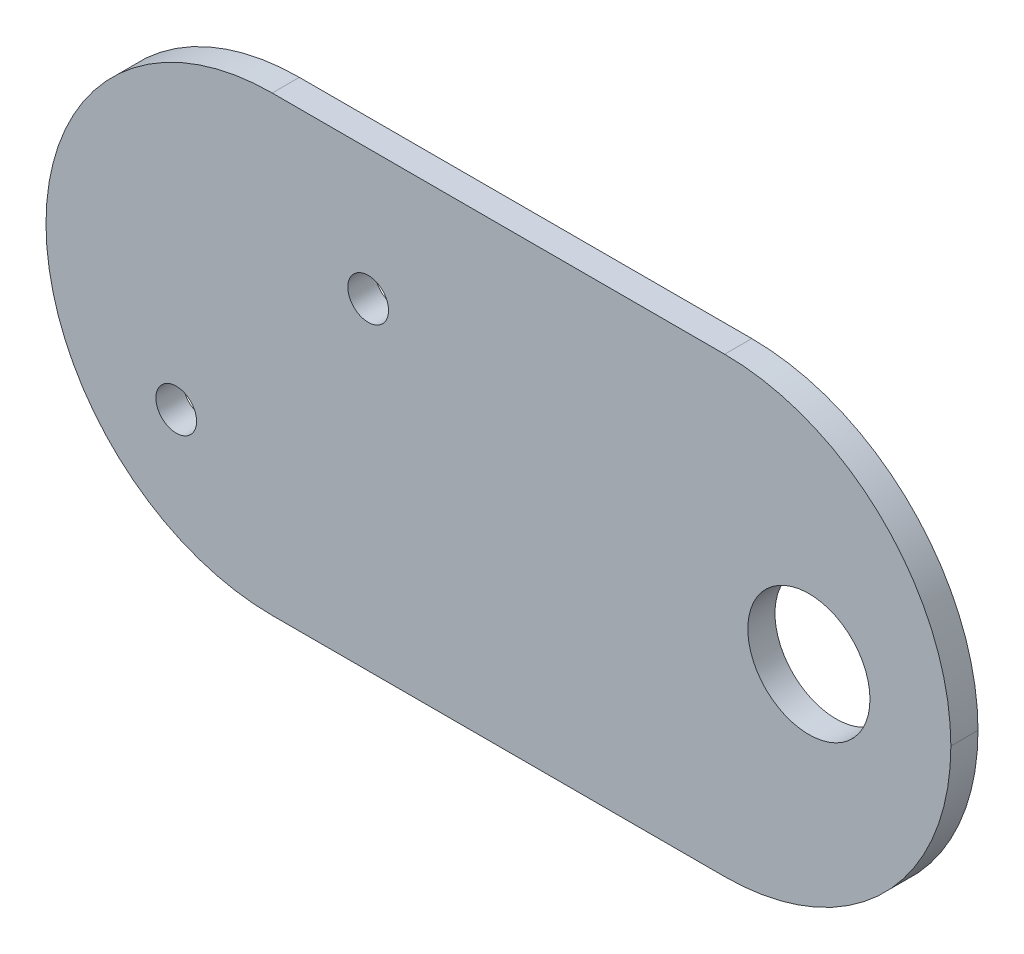
ISO-10303-21;
HEADER;
FILE_DESCRIPTION(('STEP AP214'),'2;1');
FILE_NAME('part.step','',(''),(''),'','','');
FILE_SCHEMA(('AUTOMOTIVE_DESIGN { 1 0 10303 214 1 1 1 1 }'));
ENDSEC;
DATA;
#1=APPLICATION_CONTEXT('core data for automotive mechanical design processes');
#2=APPLICATION_PROTOCOL_DEFINITION('international standard','automotive_design',2000,#1);
#3=PRODUCT_CONTEXT('',#1,'mechanical');
#4=PRODUCT('Part','Part','',(#3));
#5=PRODUCT_RELATED_PRODUCT_CATEGORY('part','',(#4));
#6=PRODUCT_DEFINITION_FORMATION('','',#4);
#7=PRODUCT_DEFINITION_CONTEXT('part definition',#1,'design');
#8=PRODUCT_DEFINITION('design','',#6,#7);
#9=PRODUCT_DEFINITION_SHAPE('','',#8);
#10=(LENGTH_UNIT() NAMED_UNIT(*) SI_UNIT(.MILLI.,.METRE.));
#11=(NAMED_UNIT(*) PLANE_ANGLE_UNIT() SI_UNIT($,.RADIAN.));
#12=(NAMED_UNIT(*) SI_UNIT($,.STERADIAN.) SOLID_ANGLE_UNIT());
#13=UNCERTAINTY_MEASURE_WITH_UNIT(LENGTH_MEASURE(1.E-05),#10,'distance_accuracy_value','');
#14=(GEOMETRIC_REPRESENTATION_CONTEXT(3) GLOBAL_UNCERTAINTY_ASSIGNED_CONTEXT((#13)) GLOBAL_UNIT_ASSIGNED_CONTEXT((#10,
#11,#12)) REPRESENTATION_CONTEXT('',''));
#15=CARTESIAN_POINT('',(0.,0.,0.));
#16=DIRECTION('',(0.,0.,1.));
#17=DIRECTION('',(1.,0.,0.));
#18=AXIS2_PLACEMENT_3D('',#15,#16,#17);
#19=CARTESIAN_POINT('',(-50.,25.,3.));
#20=DIRECTION('',(0.,-1.,0.));
#21=DIRECTION('',(0.,0.,-1.));
#22=AXIS2_PLACEMENT_3D('',#19,#20,#21);
#23=PLANE('',#22);
#24=DIRECTION('',(-1.,0.,0.));
#25=VECTOR('',#24,1.);
#26=CARTESIAN_POINT('',(-50.,25.,3.));
#27=LINE('',#26,#25);
#28=CARTESIAN_POINT('',(25.,25.,3.));
#29=VERTEX_POINT('',#28);
#30=CARTESIAN_POINT('',(-25.,25.,3.));
#31=VERTEX_POINT('',#30);
#32=EDGE_CURVE('E106',#29,#31,#27,.T.);
#33=ORIENTED_EDGE('',*,*,#32,.F.);
#34=DIRECTION('',(0.,0.,-1.));
#35=VECTOR('',#34,1.);
#36=CARTESIAN_POINT('',(25.,25.,3.));
#37=LINE('',#36,#35);
#38=CARTESIAN_POINT('',(25.,25.,0.));
#39=VERTEX_POINT('',#38);
#40=EDGE_CURVE('E91',#29,#39,#37,.T.);
#41=ORIENTED_EDGE('',*,*,#40,.T.);
#42=DIRECTION('',(-1.,0.,0.));
#43=VECTOR('',#42,1.);
#44=CARTESIAN_POINT('',(-50.,25.,0.));
#45=LINE('',#44,#43);
#46=CARTESIAN_POINT('',(-25.,25.,0.));
#47=VERTEX_POINT('',#46);
#48=EDGE_CURVE('E103',#39,#47,#45,.T.);
#49=ORIENTED_EDGE('',*,*,#48,.T.);
#50=DIRECTION('',(0.,0.,-1.));
#51=VECTOR('',#50,1.);
#52=CARTESIAN_POINT('',(-25.,25.,3.));
#53=LINE('',#52,#51);
#54=EDGE_CURVE('E108',#47,#31,#53,.F.);
#55=ORIENTED_EDGE('',*,*,#54,.T.);
#56=EDGE_LOOP('',(#33,#41,#49,#55));
#57=FACE_BOUND('',#56,.T.);
#58=ADVANCED_FACE('F33',(#57),#23,.F.);
#59=CARTESIAN_POINT('',(-50.,-25.,3.));
#60=DIRECTION('',(0.,1.,0.));
#61=DIRECTION('',(0.,0.,1.));
#62=AXIS2_PLACEMENT_3D('',#59,#60,#61);
#63=PLANE('',#62);
#64=DIRECTION('',(1.,0.,0.));
#65=VECTOR('',#64,1.);
#66=CARTESIAN_POINT('',(-50.,-25.,0.));
#67=LINE('',#66,#65);
#68=CARTESIAN_POINT('',(-25.,-25.,0.));
#69=VERTEX_POINT('',#68);
#70=CARTESIAN_POINT('',(25.,-25.,0.));
#71=VERTEX_POINT('',#70);
#72=EDGE_CURVE('E112',#69,#71,#67,.T.);
#73=ORIENTED_EDGE('',*,*,#72,.T.);
#74=DIRECTION('',(0.,0.,-1.));
#75=VECTOR('',#74,1.);
#76=CARTESIAN_POINT('',(25.,-25.,3.));
#77=LINE('',#76,#75);
#78=CARTESIAN_POINT('',(25.,-25.,3.));
#79=VERTEX_POINT('',#78);
#80=EDGE_CURVE('E11',#71,#79,#77,.F.);
#81=ORIENTED_EDGE('',*,*,#80,.T.);
#82=DIRECTION('',(1.,0.,0.));
#83=VECTOR('',#82,1.);
#84=CARTESIAN_POINT('',(-50.,-25.,3.));
#85=LINE('',#84,#83);
#86=CARTESIAN_POINT('',(-25.,-25.,3.));
#87=VERTEX_POINT('',#86);
#88=EDGE_CURVE('E120',#87,#79,#85,.T.);
#89=ORIENTED_EDGE('',*,*,#88,.F.);
#90=DIRECTION('',(0.,0.,-1.));
#91=VECTOR('',#90,1.);
#92=CARTESIAN_POINT('',(-25.,-25.,3.));
#93=LINE('',#92,#91);
#94=EDGE_CURVE('E42',#87,#69,#93,.T.);
#95=ORIENTED_EDGE('',*,*,#94,.T.);
#96=EDGE_LOOP('',(#73,#81,#89,#95));
#97=FACE_BOUND('',#96,.T.);
#98=ADVANCED_FACE('F171',(#97),#63,.F.);
#99=CARTESIAN_POINT('',(0.,0.,3.));
#100=DIRECTION('',(0.,0.,-1.));
#101=DIRECTION('',(-1.,0.,0.));
#102=AXIS2_PLACEMENT_3D('',#99,#100,#101);
#103=PLANE('',#102);
#104=CARTESIAN_POINT('',(-14.3933982822018,10.6066017177982,3.));
#105=DIRECTION('',(0.,0.,1.));
#106=DIRECTION('',(1.,0.,0.));
#107=AXIS2_PLACEMENT_3D('',#104,#105,#106);
#108=CIRCLE('',#107,2.25);
#109=CARTESIAN_POINT('',(-12.1433982822018,10.6066017177982,3.));
#110=VERTEX_POINT('',#109);
#111=EDGE_CURVE('E153',#110,#110,#108,.T.);
#112=ORIENTED_EDGE('',*,*,#111,.F.);
#113=EDGE_LOOP('',(#112));
#114=FACE_BOUND('',#113,.T.);
#115=CARTESIAN_POINT('',(-35.6066017177982,-10.6066017177982,3.));
#116=DIRECTION('',(0.,0.,1.));
#117=DIRECTION('',(1.,0.,0.));
#118=AXIS2_PLACEMENT_3D('',#115,#116,#117);
#119=CIRCLE('',#118,2.25);
#120=CARTESIAN_POINT('',(-33.3566017177982,-10.6066017177982,3.));
#121=VERTEX_POINT('',#120);
#122=EDGE_CURVE('E135',#121,#121,#119,.T.);
#123=ORIENTED_EDGE('',*,*,#122,.F.);
#124=EDGE_LOOP('',(#123));
#125=FACE_BOUND('',#124,.T.);
#126=CARTESIAN_POINT('',(34.3104530112441,0.,3.));
#127=DIRECTION('',(0.,0.,1.));
#128=DIRECTION('',(1.,0.,0.));
#129=AXIS2_PLACEMENT_3D('',#126,#127,#128);
#130=CIRCLE('',#129,6.75);
#131=CARTESIAN_POINT('',(41.0604530112441,0.,3.));
#132=VERTEX_POINT('',#131);
#133=EDGE_CURVE('E117',#132,#132,#130,.T.);
#134=ORIENTED_EDGE('',*,*,#133,.F.);
#135=EDGE_LOOP('',(#134));
#136=FACE_BOUND('',#135,.T.);
#137=CARTESIAN_POINT('',(25.,0.,3.));
#138=DIRECTION('',(0.,0.,-1.));
#139=DIRECTION('',(-1.,0.,0.));
#140=AXIS2_PLACEMENT_3D('',#137,#138,#139);
#141=CIRCLE('',#140,25.);
#142=CARTESIAN_POINT('',(50.,0.,3.));
#143=VERTEX_POINT('',#142);
#144=EDGE_CURVE('E130',#79,#143,#141,.F.);
#145=ORIENTED_EDGE('',*,*,#144,.T.);
#146=CARTESIAN_POINT('',(25.,0.,3.));
#147=DIRECTION('',(0.,0.,-1.));
#148=DIRECTION('',(-1.,0.,0.));
#149=AXIS2_PLACEMENT_3D('',#146,#147,#148);
#150=CIRCLE('',#149,25.);
#151=EDGE_CURVE('E132',#143,#29,#150,.F.);
#152=ORIENTED_EDGE('',*,*,#151,.T.);
#153=ORIENTED_EDGE('',*,*,#32,.T.);
#154=CARTESIAN_POINT('',(-25.,0.,3.));
#155=DIRECTION('',(0.,0.,-1.));
#156=DIRECTION('',(-1.,0.,0.));
#157=AXIS2_PLACEMENT_3D('',#154,#155,#156);
#158=CIRCLE('',#157,25.);
#159=CARTESIAN_POINT('',(-50.,0.,3.));
#160=VERTEX_POINT('',#159);
#161=EDGE_CURVE('E97',#31,#160,#158,.F.);
#162=ORIENTED_EDGE('',*,*,#161,.T.);
#163=CARTESIAN_POINT('',(-25.,0.,3.));
#164=DIRECTION('',(0.,0.,-1.));
#165=DIRECTION('',(-1.,0.,0.));
#166=AXIS2_PLACEMENT_3D('',#163,#164,#165);
#167=CIRCLE('',#166,25.);
#168=EDGE_CURVE('E55',#160,#87,#167,.F.);
#169=ORIENTED_EDGE('',*,*,#168,.T.);
#170=ORIENTED_EDGE('',*,*,#88,.T.);
#171=EDGE_LOOP('',(#145,#152,#153,#162,#169,#170));
#172=FACE_BOUND('',#171,.T.);
#173=ADVANCED_FACE('F146',(#114,#125,#136,#172),#103,.F.);
#174=CARTESIAN_POINT('',(0.,0.,0.));
#175=DIRECTION('',(0.,0.,-1.));
#176=DIRECTION('',(-1.,0.,0.));
#177=AXIS2_PLACEMENT_3D('',#174,#175,#176);
#178=PLANE('',#177);
#179=CARTESIAN_POINT('',(-14.3933982822018,10.6066017177982,0.));
#180=DIRECTION('',(0.,0.,1.));
#181=DIRECTION('',(1.,0.,0.));
#182=AXIS2_PLACEMENT_3D('',#179,#180,#181);
#183=CIRCLE('',#182,2.25);
#184=CARTESIAN_POINT('',(-12.1433982822018,10.6066017177982,0.));
#185=VERTEX_POINT('',#184);
#186=EDGE_CURVE('E149',#185,#185,#183,.T.);
#187=ORIENTED_EDGE('',*,*,#186,.T.);
#188=EDGE_LOOP('',(#187));
#189=FACE_BOUND('',#188,.T.);
#190=CARTESIAN_POINT('',(-35.6066017177982,-10.6066017177982,0.));
#191=DIRECTION('',(0.,0.,1.));
#192=DIRECTION('',(1.,0.,0.));
#193=AXIS2_PLACEMENT_3D('',#190,#191,#192);
#194=CIRCLE('',#193,2.25);
#195=CARTESIAN_POINT('',(-33.3566017177982,-10.6066017177982,0.));
#196=VERTEX_POINT('',#195);
#197=EDGE_CURVE('E137',#196,#196,#194,.T.);
#198=ORIENTED_EDGE('',*,*,#197,.T.);
#199=EDGE_LOOP('',(#198));
#200=FACE_BOUND('',#199,.T.);
#201=CARTESIAN_POINT('',(34.3104530112441,0.,0.));
#202=DIRECTION('',(0.,0.,1.));
#203=DIRECTION('',(1.,0.,0.));
#204=AXIS2_PLACEMENT_3D('',#201,#202,#203);
#205=CIRCLE('',#204,6.75);
#206=CARTESIAN_POINT('',(41.0604530112441,0.,0.));
#207=VERTEX_POINT('',#206);
#208=EDGE_CURVE('E113',#207,#207,#205,.T.);
#209=ORIENTED_EDGE('',*,*,#208,.T.);
#210=EDGE_LOOP('',(#209));
#211=FACE_BOUND('',#210,.T.);
#212=ORIENTED_EDGE('',*,*,#48,.F.);
#213=CARTESIAN_POINT('',(25.,0.,0.));
#214=DIRECTION('',(0.,0.,-1.));
#215=DIRECTION('',(-1.,0.,0.));
#216=AXIS2_PLACEMENT_3D('',#213,#214,#215);
#217=CIRCLE('',#216,25.);
#218=CARTESIAN_POINT('',(50.,0.,0.));
#219=VERTEX_POINT('',#218);
#220=EDGE_CURVE('E87',#39,#219,#217,.T.);
#221=ORIENTED_EDGE('',*,*,#220,.T.);
#222=CARTESIAN_POINT('',(25.,0.,0.));
#223=DIRECTION('',(0.,0.,-1.));
#224=DIRECTION('',(-1.,0.,0.));
#225=AXIS2_PLACEMENT_3D('',#222,#223,#224);
#226=CIRCLE('',#225,25.);
#227=EDGE_CURVE('E98',#219,#71,#226,.T.);
#228=ORIENTED_EDGE('',*,*,#227,.T.);
#229=ORIENTED_EDGE('',*,*,#72,.F.);
#230=CARTESIAN_POINT('',(-25.,0.,0.));
#231=DIRECTION('',(0.,0.,-1.));
#232=DIRECTION('',(-1.,0.,0.));
#233=AXIS2_PLACEMENT_3D('',#230,#231,#232);
#234=CIRCLE('',#233,25.);
#235=CARTESIAN_POINT('',(-50.,0.,0.));
#236=VERTEX_POINT('',#235);
#237=EDGE_CURVE('E125',#69,#236,#234,.T.);
#238=ORIENTED_EDGE('',*,*,#237,.T.);
#239=CARTESIAN_POINT('',(-25.,0.,0.));
#240=DIRECTION('',(0.,0.,-1.));
#241=DIRECTION('',(-1.,0.,0.));
#242=AXIS2_PLACEMENT_3D('',#239,#240,#241);
#243=CIRCLE('',#242,25.);
#244=EDGE_CURVE('E107',#236,#47,#243,.T.);
#245=ORIENTED_EDGE('',*,*,#244,.T.);
#246=EDGE_LOOP('',(#212,#221,#228,#229,#238,#245));
#247=FACE_BOUND('',#246,.T.);
#248=ADVANCED_FACE('F110',(#189,#200,#211,#247),#178,.T.);
#249=CARTESIAN_POINT('',(34.3104530112441,0.,0.));
#250=DIRECTION('',(0.,0.,1.));
#251=DIRECTION('',(1.,0.,0.));
#252=AXIS2_PLACEMENT_3D('',#249,#250,#251);
#253=CYLINDRICAL_SURFACE('',#252,6.75);
#254=ORIENTED_EDGE('',*,*,#208,.F.);
#255=EDGE_LOOP('',(#254));
#256=FACE_BOUND('',#255,.T.);
#257=ORIENTED_EDGE('',*,*,#133,.T.);
#258=EDGE_LOOP('',(#257));
#259=FACE_BOUND('',#258,.T.);
#260=ADVANCED_FACE('F177',(#256,#259),#253,.F.);
#261=CARTESIAN_POINT('',(-35.6066017177982,-10.6066017177982,0.));
#262=DIRECTION('',(0.,0.,1.));
#263=DIRECTION('',(1.,0.,0.));
#264=AXIS2_PLACEMENT_3D('',#261,#262,#263);
#265=CYLINDRICAL_SURFACE('',#264,2.25);
#266=ORIENTED_EDGE('',*,*,#197,.F.);
#267=EDGE_LOOP('',(#266));
#268=FACE_BOUND('',#267,.T.);
#269=ORIENTED_EDGE('',*,*,#122,.T.);
#270=EDGE_LOOP('',(#269));
#271=FACE_BOUND('',#270,.T.);
#272=ADVANCED_FACE('F165',(#268,#271),#265,.F.);
#273=CARTESIAN_POINT('',(-14.3933982822018,10.6066017177982,0.));
#274=DIRECTION('',(0.,0.,1.));
#275=DIRECTION('',(1.,0.,0.));
#276=AXIS2_PLACEMENT_3D('',#273,#274,#275);
#277=CYLINDRICAL_SURFACE('',#276,2.25);
#278=ORIENTED_EDGE('',*,*,#186,.F.);
#279=EDGE_LOOP('',(#278));
#280=FACE_BOUND('',#279,.T.);
#281=ORIENTED_EDGE('',*,*,#111,.T.);
#282=EDGE_LOOP('',(#281));
#283=FACE_BOUND('',#282,.T.);
#284=ADVANCED_FACE('F161',(#280,#283),#277,.F.);
#285=CARTESIAN_POINT('',(25.,0.,3.));
#286=DIRECTION('',(0.,0.,-1.));
#287=DIRECTION('',(-1.,0.,0.));
#288=AXIS2_PLACEMENT_3D('',#285,#286,#287);
#289=CYLINDRICAL_SURFACE('',#288,25.);
#290=DIRECTION('',(0.,0.,-1.));
#291=VECTOR('',#290,1.);
#292=CARTESIAN_POINT('',(50.,0.,3.));
#293=LINE('',#292,#291);
#294=EDGE_CURVE('E93',#143,#219,#293,.T.);
#295=ORIENTED_EDGE('',*,*,#294,.F.);
#296=ORIENTED_EDGE('',*,*,#144,.F.);
#297=ORIENTED_EDGE('',*,*,#80,.F.);
#298=ORIENTED_EDGE('',*,*,#227,.F.);
#299=EDGE_LOOP('',(#295,#296,#297,#298));
#300=FACE_BOUND('',#299,.T.);
#301=ADVANCED_FACE('F164',(#300),#289,.T.);
#302=CARTESIAN_POINT('',(25.,0.,3.));
#303=DIRECTION('',(0.,0.,-1.));
#304=DIRECTION('',(-1.,0.,0.));
#305=AXIS2_PLACEMENT_3D('',#302,#303,#304);
#306=CYLINDRICAL_SURFACE('',#305,25.);
#307=ORIENTED_EDGE('',*,*,#151,.F.);
#308=ORIENTED_EDGE('',*,*,#294,.T.);
#309=ORIENTED_EDGE('',*,*,#220,.F.);
#310=ORIENTED_EDGE('',*,*,#40,.F.);
#311=EDGE_LOOP('',(#307,#308,#309,#310));
#312=FACE_BOUND('',#311,.T.);
#313=ADVANCED_FACE('F90',(#312),#306,.T.);
#314=CARTESIAN_POINT('',(-25.,0.,3.));
#315=DIRECTION('',(0.,0.,-1.));
#316=DIRECTION('',(-1.,0.,0.));
#317=AXIS2_PLACEMENT_3D('',#314,#315,#316);
#318=CYLINDRICAL_SURFACE('',#317,25.);
#319=DIRECTION('',(0.,0.,-1.));
#320=VECTOR('',#319,1.);
#321=CARTESIAN_POINT('',(-50.,0.,3.));
#322=LINE('',#321,#320);
#323=EDGE_CURVE('E37',#160,#236,#322,.T.);
#324=ORIENTED_EDGE('',*,*,#323,.F.);
#325=ORIENTED_EDGE('',*,*,#161,.F.);
#326=ORIENTED_EDGE('',*,*,#54,.F.);
#327=ORIENTED_EDGE('',*,*,#244,.F.);
#328=EDGE_LOOP('',(#324,#325,#326,#327));
#329=FACE_BOUND('',#328,.T.);
#330=ADVANCED_FACE('F35',(#329),#318,.T.);
#331=CARTESIAN_POINT('',(-25.,0.,3.));
#332=DIRECTION('',(0.,0.,-1.));
#333=DIRECTION('',(-1.,0.,0.));
#334=AXIS2_PLACEMENT_3D('',#331,#332,#333);
#335=CYLINDRICAL_SURFACE('',#334,25.);
#336=ORIENTED_EDGE('',*,*,#168,.F.);
#337=ORIENTED_EDGE('',*,*,#323,.T.);
#338=ORIENTED_EDGE('',*,*,#237,.F.);
#339=ORIENTED_EDGE('',*,*,#94,.F.);
#340=EDGE_LOOP('',(#336,#337,#338,#339));
#341=FACE_BOUND('',#340,.T.);
#342=ADVANCED_FACE('F142',(#341),#335,.T.);
#343=CLOSED_SHELL('',(#58,#98,#173,#248,#260,#272,#284,#301,#313,#330,#342));
#344=MANIFOLD_SOLID_BREP('B2',#343);
#345=ADVANCED_BREP_SHAPE_REPRESENTATION('',(#18,#344),#14);
#346=SHAPE_DEFINITION_REPRESENTATION(#9,#345);
ENDSEC;
END-ISO-10303-21;
